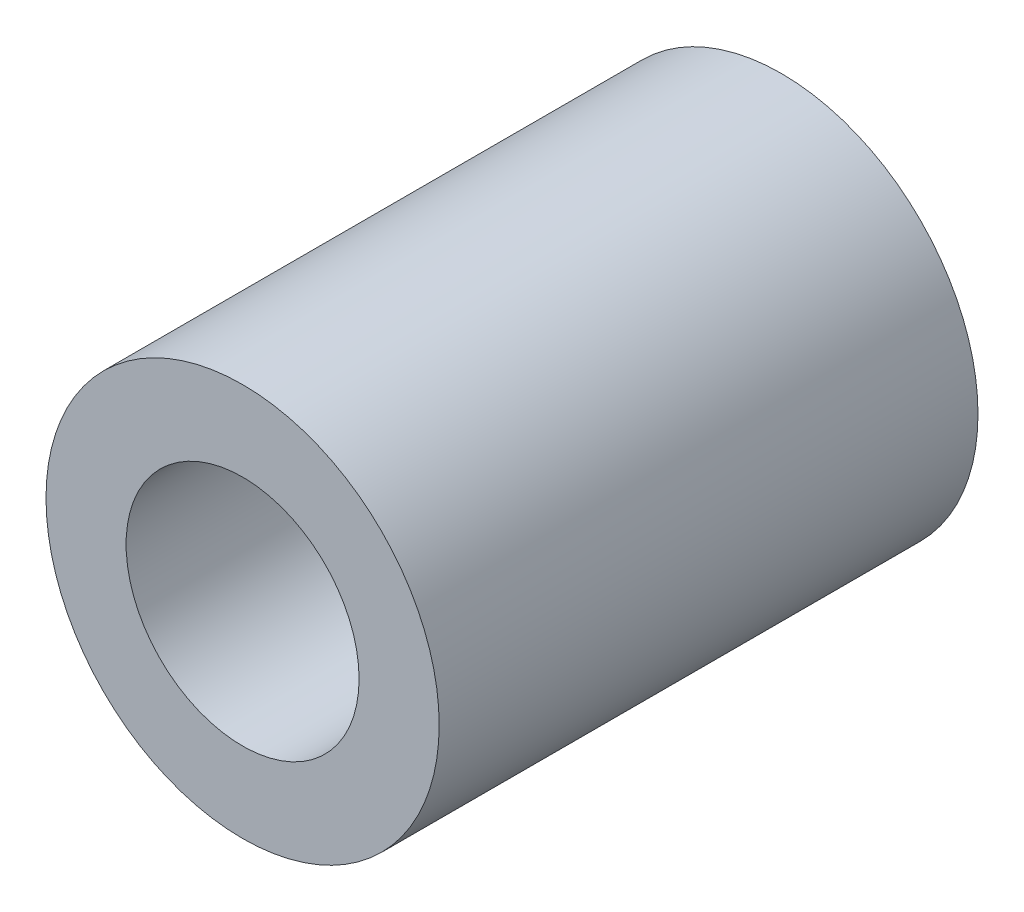
ISO-10303-21;
HEADER;
FILE_DESCRIPTION(('STEP AP214'),'2;1');
FILE_NAME('part.step','',(''),(''),'','','');
FILE_SCHEMA(('AUTOMOTIVE_DESIGN { 1 0 10303 214 1 1 1 1 }'));
ENDSEC;
DATA;
#1=APPLICATION_CONTEXT('core data for automotive mechanical design processes');
#2=APPLICATION_PROTOCOL_DEFINITION('international standard','automotive_design',2000,#1);
#3=PRODUCT_CONTEXT('',#1,'mechanical');
#4=PRODUCT('Part','Part','',(#3));
#5=PRODUCT_RELATED_PRODUCT_CATEGORY('part','',(#4));
#6=PRODUCT_DEFINITION_FORMATION('','',#4);
#7=PRODUCT_DEFINITION_CONTEXT('part definition',#1,'design');
#8=PRODUCT_DEFINITION('design','',#6,#7);
#9=PRODUCT_DEFINITION_SHAPE('','',#8);
#10=(LENGTH_UNIT() NAMED_UNIT(*) SI_UNIT(.MILLI.,.METRE.));
#11=(NAMED_UNIT(*) PLANE_ANGLE_UNIT() SI_UNIT($,.RADIAN.));
#12=(NAMED_UNIT(*) SI_UNIT($,.STERADIAN.) SOLID_ANGLE_UNIT());
#13=UNCERTAINTY_MEASURE_WITH_UNIT(LENGTH_MEASURE(1.E-05),#10,'distance_accuracy_value','');
#14=(GEOMETRIC_REPRESENTATION_CONTEXT(3) GLOBAL_UNCERTAINTY_ASSIGNED_CONTEXT((#13)) GLOBAL_UNIT_ASSIGNED_CONTEXT((#10,
#11,#12)) REPRESENTATION_CONTEXT('',''));
#15=CARTESIAN_POINT('',(0.,0.,0.));
#16=DIRECTION('',(0.,0.,1.));
#17=DIRECTION('',(1.,0.,0.));
#18=AXIS2_PLACEMENT_3D('',#15,#16,#17);
#19=CARTESIAN_POINT('',(0.,0.,-18.5));
#20=DIRECTION('',(0.,0.,1.));
#21=DIRECTION('',(1.,0.,0.));
#22=AXIS2_PLACEMENT_3D('',#19,#20,#21);
#23=CYLINDRICAL_SURFACE('',#22,13.5);
#24=CARTESIAN_POINT('',(0.,0.,-18.5));
#25=DIRECTION('',(0.,0.,1.));
#26=DIRECTION('',(1.,0.,0.));
#27=AXIS2_PLACEMENT_3D('',#24,#25,#26);
#28=CIRCLE('',#27,13.5);
#29=CARTESIAN_POINT('',(13.5,0.,-18.5));
#30=VERTEX_POINT('',#29);
#31=EDGE_CURVE('E10',#30,#30,#28,.T.);
#32=ORIENTED_EDGE('',*,*,#31,.T.);
#33=EDGE_LOOP('',(#32));
#34=FACE_BOUND('',#33,.T.);
#35=CARTESIAN_POINT('',(0.,0.,18.5));
#36=DIRECTION('',(0.,0.,1.));
#37=DIRECTION('',(1.,0.,0.));
#38=AXIS2_PLACEMENT_3D('',#35,#36,#37);
#39=CIRCLE('',#38,13.5);
#40=CARTESIAN_POINT('',(13.5,0.,18.5));
#41=VERTEX_POINT('',#40);
#42=EDGE_CURVE('E49',#41,#41,#39,.T.);
#43=ORIENTED_EDGE('',*,*,#42,.F.);
#44=EDGE_LOOP('',(#43));
#45=FACE_BOUND('',#44,.T.);
#46=ADVANCED_FACE('F37',(#34,#45),#23,.T.);
#47=CARTESIAN_POINT('',(0.,0.,-18.5));
#48=DIRECTION('',(0.,0.,1.));
#49=DIRECTION('',(1.,0.,0.));
#50=AXIS2_PLACEMENT_3D('',#47,#48,#49);
#51=PLANE('',#50);
#52=CARTESIAN_POINT('',(0.,0.,-18.5));
#53=DIRECTION('',(0.,0.,1.));
#54=DIRECTION('',(1.,0.,0.));
#55=AXIS2_PLACEMENT_3D('',#52,#53,#54);
#56=CIRCLE('',#55,8.);
#57=CARTESIAN_POINT('',(8.,0.,-18.5));
#58=VERTEX_POINT('',#57);
#59=EDGE_CURVE('E44',#58,#58,#56,.T.);
#60=ORIENTED_EDGE('',*,*,#59,.T.);
#61=EDGE_LOOP('',(#60));
#62=FACE_BOUND('',#61,.T.);
#63=ORIENTED_EDGE('',*,*,#31,.F.);
#64=EDGE_LOOP('',(#63));
#65=FACE_BOUND('',#64,.T.);
#66=ADVANCED_FACE('F70',(#62,#65),#51,.F.);
#67=CARTESIAN_POINT('',(0.,0.,-18.5));
#68=DIRECTION('',(0.,0.,1.));
#69=DIRECTION('',(1.,0.,0.));
#70=AXIS2_PLACEMENT_3D('',#67,#68,#69);
#71=CYLINDRICAL_SURFACE('',#70,8.);
#72=ORIENTED_EDGE('',*,*,#59,.F.);
#73=EDGE_LOOP('',(#72));
#74=FACE_BOUND('',#73,.T.);
#75=CARTESIAN_POINT('',(0.,0.,18.5));
#76=DIRECTION('',(0.,0.,1.));
#77=DIRECTION('',(1.,0.,0.));
#78=AXIS2_PLACEMENT_3D('',#75,#76,#77);
#79=CIRCLE('',#78,8.);
#80=CARTESIAN_POINT('',(8.,0.,18.5));
#81=VERTEX_POINT('',#80);
#82=EDGE_CURVE('E54',#81,#81,#79,.T.);
#83=ORIENTED_EDGE('',*,*,#82,.T.);
#84=EDGE_LOOP('',(#83));
#85=FACE_BOUND('',#84,.T.);
#86=ADVANCED_FACE('F61',(#74,#85),#71,.F.);
#87=CARTESIAN_POINT('',(0.,0.,18.5));
#88=DIRECTION('',(0.,0.,1.));
#89=DIRECTION('',(1.,0.,0.));
#90=AXIS2_PLACEMENT_3D('',#87,#88,#89);
#91=PLANE('',#90);
#92=ORIENTED_EDGE('',*,*,#42,.T.);
#93=EDGE_LOOP('',(#92));
#94=FACE_BOUND('',#93,.T.);
#95=ORIENTED_EDGE('',*,*,#82,.F.);
#96=EDGE_LOOP('',(#95));
#97=FACE_BOUND('',#96,.T.);
#98=ADVANCED_FACE('F63',(#94,#97),#91,.T.);
#99=CLOSED_SHELL('',(#46,#66,#86,#98));
#100=MANIFOLD_SOLID_BREP('B2',#99);
#101=ADVANCED_BREP_SHAPE_REPRESENTATION('',(#18,#100),#14);
#102=SHAPE_DEFINITION_REPRESENTATION(#9,#101);
ENDSEC;
END-ISO-10303-21;
